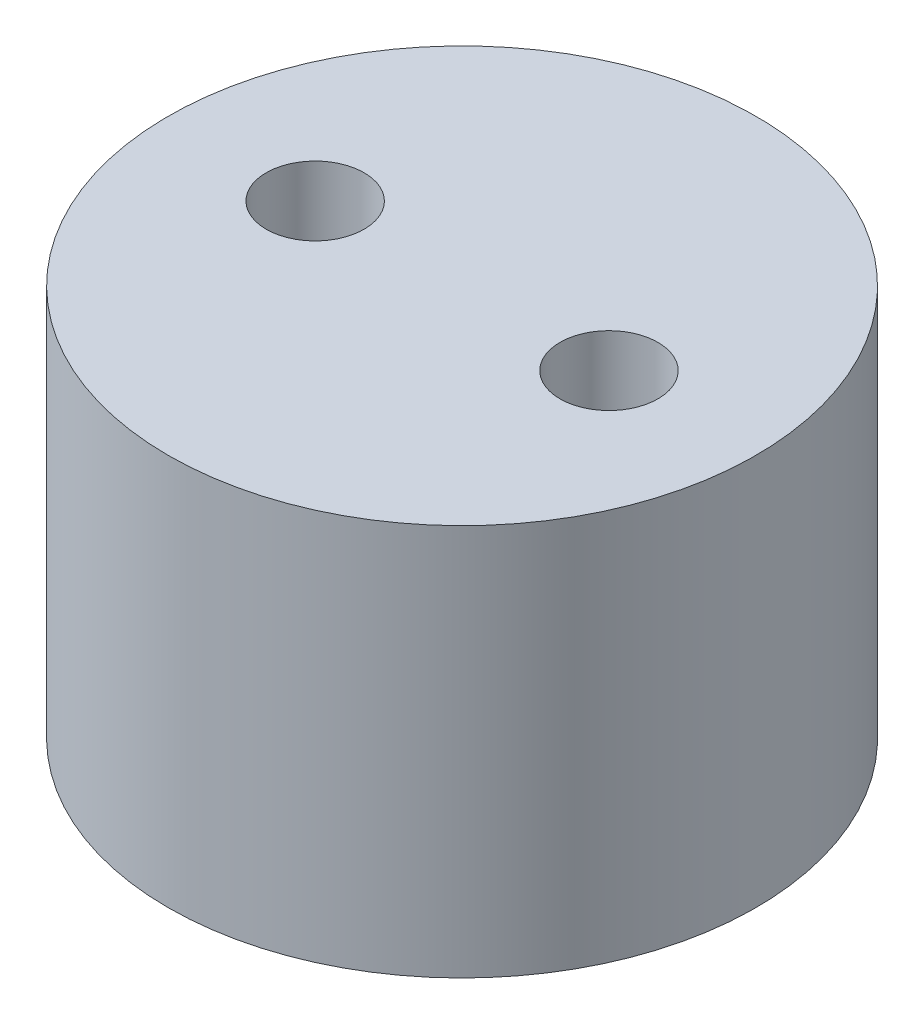
ISO-10303-21;
HEADER;
FILE_DESCRIPTION(('STEP AP214'),'2;1');
FILE_NAME('part.step','',(''),(''),'','','');
FILE_SCHEMA(('AUTOMOTIVE_DESIGN { 1 0 10303 214 1 1 1 1 }'));
ENDSEC;
DATA;
#1=APPLICATION_CONTEXT('core data for automotive mechanical design processes');
#2=APPLICATION_PROTOCOL_DEFINITION('international standard','automotive_design',2000,#1);
#3=PRODUCT_CONTEXT('',#1,'mechanical');
#4=PRODUCT('Part','Part','',(#3));
#5=PRODUCT_RELATED_PRODUCT_CATEGORY('part','',(#4));
#6=PRODUCT_DEFINITION_FORMATION('','',#4);
#7=PRODUCT_DEFINITION_CONTEXT('part definition',#1,'design');
#8=PRODUCT_DEFINITION('design','',#6,#7);
#9=PRODUCT_DEFINITION_SHAPE('','',#8);
#10=(LENGTH_UNIT() NAMED_UNIT(*) SI_UNIT(.MILLI.,.METRE.));
#11=(NAMED_UNIT(*) PLANE_ANGLE_UNIT() SI_UNIT($,.RADIAN.));
#12=(NAMED_UNIT(*) SI_UNIT($,.STERADIAN.) SOLID_ANGLE_UNIT());
#13=UNCERTAINTY_MEASURE_WITH_UNIT(LENGTH_MEASURE(1.E-05),#10,'distance_accuracy_value','');
#14=(GEOMETRIC_REPRESENTATION_CONTEXT(3) GLOBAL_UNCERTAINTY_ASSIGNED_CONTEXT((#13)) GLOBAL_UNIT_ASSIGNED_CONTEXT((#10,
#11,#12)) REPRESENTATION_CONTEXT('',''));
#15=CARTESIAN_POINT('',(0.,0.,0.));
#16=DIRECTION('',(0.,0.,1.));
#17=DIRECTION('',(1.,0.,0.));
#18=AXIS2_PLACEMENT_3D('',#15,#16,#17);
#19=CARTESIAN_POINT('',(0.,20.,0.));
#20=DIRECTION('',(0.,1.,0.));
#21=DIRECTION('',(0.,0.,1.));
#22=AXIS2_PLACEMENT_3D('',#19,#20,#21);
#23=PLANE('',#22);
#24=CARTESIAN_POINT('',(-7.5,20.,0.));
#25=DIRECTION('',(0.,1.,0.));
#26=DIRECTION('',(0.,0.,1.));
#27=AXIS2_PLACEMENT_3D('',#24,#25,#26);
#28=CIRCLE('',#27,2.5);
#29=CARTESIAN_POINT('',(-7.5,20.,2.5));
#30=VERTEX_POINT('',#29);
#31=EDGE_CURVE('E54',#30,#30,#28,.T.);
#32=ORIENTED_EDGE('',*,*,#31,.F.);
#33=EDGE_LOOP('',(#32));
#34=FACE_BOUND('',#33,.T.);
#35=CARTESIAN_POINT('',(0.,20.,0.));
#36=DIRECTION('',(0.,1.,0.));
#37=DIRECTION('',(0.,0.,1.));
#38=AXIS2_PLACEMENT_3D('',#35,#36,#37);
#39=CIRCLE('',#38,15.);
#40=CARTESIAN_POINT('',(0.,20.,15.));
#41=VERTEX_POINT('',#40);
#42=EDGE_CURVE('E10',#41,#41,#39,.T.);
#43=ORIENTED_EDGE('',*,*,#42,.T.);
#44=EDGE_LOOP('',(#43));
#45=FACE_BOUND('',#44,.T.);
#46=CARTESIAN_POINT('',(7.5,20.,0.));
#47=DIRECTION('',(0.,1.,0.));
#48=DIRECTION('',(0.,0.,1.));
#49=AXIS2_PLACEMENT_3D('',#46,#47,#48);
#50=CIRCLE('',#49,2.5);
#51=CARTESIAN_POINT('',(7.5,20.,2.5));
#52=VERTEX_POINT('',#51);
#53=EDGE_CURVE('E60',#52,#52,#50,.T.);
#54=ORIENTED_EDGE('',*,*,#53,.F.);
#55=EDGE_LOOP('',(#54));
#56=FACE_BOUND('',#55,.T.);
#57=ADVANCED_FACE('F41',(#34,#45,#56),#23,.T.);
#58=CARTESIAN_POINT('',(0.,0.,0.));
#59=DIRECTION('',(0.,1.,0.));
#60=DIRECTION('',(0.,0.,1.));
#61=AXIS2_PLACEMENT_3D('',#58,#59,#60);
#62=PLANE('',#61);
#63=CARTESIAN_POINT('',(0.,0.,0.));
#64=DIRECTION('',(0.,1.,0.));
#65=DIRECTION('',(0.,0.,1.));
#66=AXIS2_PLACEMENT_3D('',#63,#64,#65);
#67=CIRCLE('',#66,15.);
#68=CARTESIAN_POINT('',(0.,0.,15.));
#69=VERTEX_POINT('',#68);
#70=EDGE_CURVE('E45',#69,#69,#67,.T.);
#71=ORIENTED_EDGE('',*,*,#70,.F.);
#72=EDGE_LOOP('',(#71));
#73=FACE_BOUND('',#72,.T.);
#74=CARTESIAN_POINT('',(-7.5,0.,0.));
#75=DIRECTION('',(0.,1.,0.));
#76=DIRECTION('',(0.,0.,1.));
#77=AXIS2_PLACEMENT_3D('',#74,#75,#76);
#78=CIRCLE('',#77,2.5);
#79=CARTESIAN_POINT('',(-7.5,0.,2.5));
#80=VERTEX_POINT('',#79);
#81=EDGE_CURVE('E56',#80,#80,#78,.T.);
#82=ORIENTED_EDGE('',*,*,#81,.T.);
#83=EDGE_LOOP('',(#82));
#84=FACE_BOUND('',#83,.T.);
#85=CARTESIAN_POINT('',(7.5,0.,0.));
#86=DIRECTION('',(0.,1.,0.));
#87=DIRECTION('',(0.,0.,1.));
#88=AXIS2_PLACEMENT_3D('',#85,#86,#87);
#89=CIRCLE('',#88,2.5);
#90=CARTESIAN_POINT('',(7.5,0.,2.5));
#91=VERTEX_POINT('',#90);
#92=EDGE_CURVE('E64',#91,#91,#89,.T.);
#93=ORIENTED_EDGE('',*,*,#92,.T.);
#94=EDGE_LOOP('',(#93));
#95=FACE_BOUND('',#94,.T.);
#96=ADVANCED_FACE('F76',(#73,#84,#95),#62,.F.);
#97=CARTESIAN_POINT('',(0.,20.,0.));
#98=DIRECTION('',(0.,-1.,0.));
#99=DIRECTION('',(0.,0.,-1.));
#100=AXIS2_PLACEMENT_3D('',#97,#98,#99);
#101=CYLINDRICAL_SURFACE('',#100,15.);
#102=ORIENTED_EDGE('',*,*,#42,.F.);
#103=EDGE_LOOP('',(#102));
#104=FACE_BOUND('',#103,.T.);
#105=ORIENTED_EDGE('',*,*,#70,.T.);
#106=EDGE_LOOP('',(#105));
#107=FACE_BOUND('',#106,.T.);
#108=ADVANCED_FACE('F43',(#104,#107),#101,.T.);
#109=CARTESIAN_POINT('',(-7.5,20.,0.));
#110=DIRECTION('',(0.,-1.,0.));
#111=DIRECTION('',(0.,0.,-1.));
#112=AXIS2_PLACEMENT_3D('',#109,#110,#111);
#113=CYLINDRICAL_SURFACE('',#112,2.5);
#114=ORIENTED_EDGE('',*,*,#31,.T.);
#115=EDGE_LOOP('',(#114));
#116=FACE_BOUND('',#115,.T.);
#117=ORIENTED_EDGE('',*,*,#81,.F.);
#118=EDGE_LOOP('',(#117));
#119=FACE_BOUND('',#118,.T.);
#120=ADVANCED_FACE('F85',(#116,#119),#113,.F.);
#121=CARTESIAN_POINT('',(7.5,20.,0.));
#122=DIRECTION('',(0.,-1.,0.));
#123=DIRECTION('',(0.,0.,-1.));
#124=AXIS2_PLACEMENT_3D('',#121,#122,#123);
#125=CYLINDRICAL_SURFACE('',#124,2.5);
#126=ORIENTED_EDGE('',*,*,#53,.T.);
#127=EDGE_LOOP('',(#126));
#128=FACE_BOUND('',#127,.T.);
#129=ORIENTED_EDGE('',*,*,#92,.F.);
#130=EDGE_LOOP('',(#129));
#131=FACE_BOUND('',#130,.T.);
#132=ADVANCED_FACE('F72',(#128,#131),#125,.F.);
#133=CLOSED_SHELL('',(#57,#96,#108,#120,#132));
#134=MANIFOLD_SOLID_BREP('B2',#133);
#135=ADVANCED_BREP_SHAPE_REPRESENTATION('',(#18,#134),#14);
#136=SHAPE_DEFINITION_REPRESENTATION(#9,#135);
ENDSEC;
END-ISO-10303-21;
